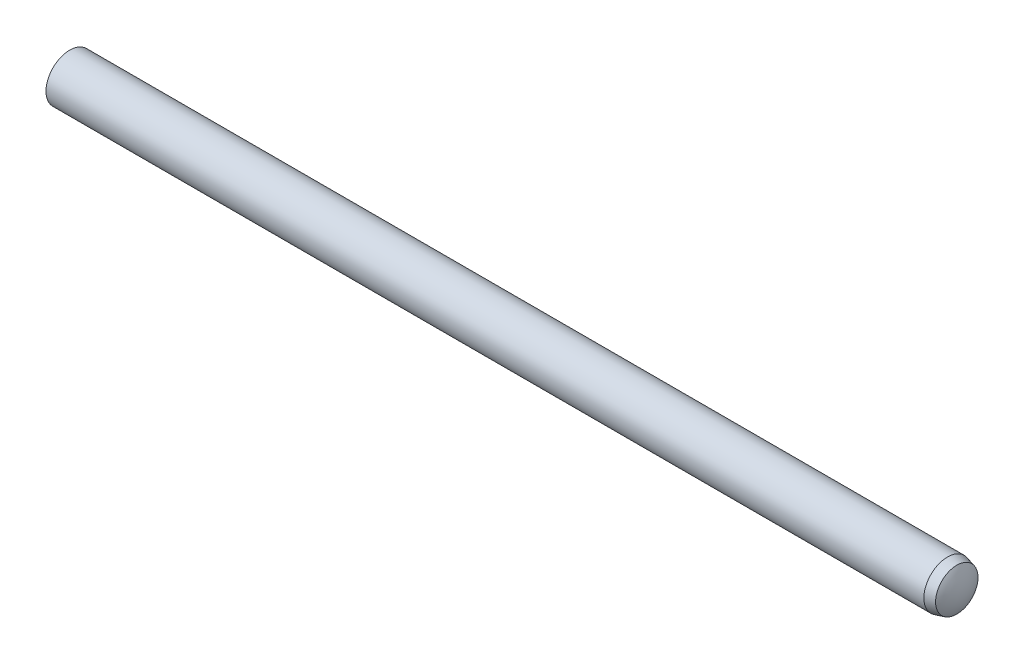
ISO-10303-21;
HEADER;
FILE_DESCRIPTION(('STEP AP214'),'2;1');
FILE_NAME('part.step','',(''),(''),'','','');
FILE_SCHEMA(('AUTOMOTIVE_DESIGN { 1 0 10303 214 1 1 1 1 }'));
ENDSEC;
DATA;
#1=APPLICATION_CONTEXT('core data for automotive mechanical design processes');
#2=APPLICATION_PROTOCOL_DEFINITION('international standard','automotive_design',2000,#1);
#3=PRODUCT_CONTEXT('',#1,'mechanical');
#4=PRODUCT('Part','Part','',(#3));
#5=PRODUCT_RELATED_PRODUCT_CATEGORY('part','',(#4));
#6=PRODUCT_DEFINITION_FORMATION('','',#4);
#7=PRODUCT_DEFINITION_CONTEXT('part definition',#1,'design');
#8=PRODUCT_DEFINITION('design','',#6,#7);
#9=PRODUCT_DEFINITION_SHAPE('','',#8);
#10=(LENGTH_UNIT() NAMED_UNIT(*) SI_UNIT(.MILLI.,.METRE.));
#11=(NAMED_UNIT(*) PLANE_ANGLE_UNIT() SI_UNIT($,.RADIAN.));
#12=(NAMED_UNIT(*) SI_UNIT($,.STERADIAN.) SOLID_ANGLE_UNIT());
#13=UNCERTAINTY_MEASURE_WITH_UNIT(LENGTH_MEASURE(1.E-05),#10,'distance_accuracy_value','');
#14=(GEOMETRIC_REPRESENTATION_CONTEXT(3) GLOBAL_UNCERTAINTY_ASSIGNED_CONTEXT((#13)) GLOBAL_UNIT_ASSIGNED_CONTEXT((#10,
#11,#12)) REPRESENTATION_CONTEXT('',''));
#15=CARTESIAN_POINT('',(0.,0.,0.));
#16=DIRECTION('',(0.,0.,1.));
#17=DIRECTION('',(1.,0.,0.));
#18=AXIS2_PLACEMENT_3D('',#15,#16,#17);
#19=CARTESIAN_POINT('',(-19.,0.,0.));
#20=DIRECTION('',(1.,0.,0.));
#21=DIRECTION('',(0.,0.,-1.));
#22=AXIS2_PLACEMENT_3D('',#19,#20,#21);
#23=CYLINDRICAL_SURFACE('',#22,1.);
#24=CARTESIAN_POINT('',(18.35,0.,0.));
#25=DIRECTION('',(-1.,0.,0.));
#26=DIRECTION('',(0.,0.,1.));
#27=AXIS2_PLACEMENT_3D('',#24,#25,#26);
#28=CIRCLE('',#27,0.999999999999999);
#29=CARTESIAN_POINT('',(18.35,0.,0.999999999999999));
#30=VERTEX_POINT('',#29);
#31=EDGE_CURVE('E13',#30,#30,#28,.T.);
#32=ORIENTED_EDGE('',*,*,#31,.T.);
#33=EDGE_LOOP('',(#32));
#34=FACE_BOUND('',#33,.T.);
#35=CARTESIAN_POINT('',(-18.7,0.,0.));
#36=DIRECTION('',(-1.,0.,0.));
#37=DIRECTION('',(0.,0.,1.));
#38=AXIS2_PLACEMENT_3D('',#35,#36,#37);
#39=CIRCLE('',#38,1.);
#40=CARTESIAN_POINT('',(-18.7,0.,1.));
#41=VERTEX_POINT('',#40);
#42=EDGE_CURVE('E64',#41,#41,#39,.T.);
#43=ORIENTED_EDGE('',*,*,#42,.F.);
#44=EDGE_LOOP('',(#43));
#45=FACE_BOUND('',#44,.T.);
#46=ADVANCED_FACE('F44',(#34,#45),#23,.T.);
#47=CARTESIAN_POINT('',(18.35,0.,0.));
#48=DIRECTION('',(-1.,0.,0.));
#49=DIRECTION('',(0.,0.,1.));
#50=AXIS2_PLACEMENT_3D('',#47,#48,#49);
#51=CONICAL_SURFACE('',#50,0.999999999999999,0.261799387799149);
#52=CARTESIAN_POINT('',(18.74,0.,0.));
#53=DIRECTION('',(-1.,0.,0.));
#54=DIRECTION('',(0.,0.,1.));
#55=AXIS2_PLACEMENT_3D('',#52,#53,#54);
#56=CIRCLE('',#55,0.89549981495186);
#57=CARTESIAN_POINT('',(18.74,0.,0.89549981495186));
#58=VERTEX_POINT('',#57);
#59=EDGE_CURVE('E51',#58,#58,#56,.T.);
#60=ORIENTED_EDGE('',*,*,#59,.T.);
#61=EDGE_LOOP('',(#60));
#62=FACE_BOUND('',#61,.T.);
#63=ORIENTED_EDGE('',*,*,#31,.F.);
#64=EDGE_LOOP('',(#63));
#65=FACE_BOUND('',#64,.T.);
#66=ADVANCED_FACE('F70',(#62,#65),#51,.T.);
#67=CARTESIAN_POINT('',(17.3278463104254,0.,0.));
#68=DIRECTION('',(-1.,0.,0.));
#69=DIRECTION('',(0.,1.,0.));
#70=AXIS2_PLACEMENT_3D('',#67,#68,#69);
#71=SPHERICAL_SURFACE('',#70,1.6721536895746);
#72=CARTESIAN_POINT('',(19.,0.,0.));
#73=VERTEX_POINT('',#72);
#74=VERTEX_LOOP('',#73);
#75=FACE_BOUND('',#74,.T.);
#76=ORIENTED_EDGE('',*,*,#59,.F.);
#77=EDGE_LOOP('',(#76));
#78=FACE_BOUND('',#77,.T.);
#79=ADVANCED_FACE('F60',(#75,#78),#71,.T.);
#80=CARTESIAN_POINT('',(-17.1833333333333,0.,0.));
#81=DIRECTION('',(-1.,0.,0.));
#82=DIRECTION('',(0.,-1.,0.));
#83=AXIS2_PLACEMENT_3D('',#80,#81,#82);
#84=SPHERICAL_SURFACE('',#83,1.81666666666666);
#85=CARTESIAN_POINT('',(-19.,0.,0.));
#86=VERTEX_POINT('',#85);
#87=VERTEX_LOOP('',#86);
#88=FACE_BOUND('',#87,.T.);
#89=ORIENTED_EDGE('',*,*,#42,.T.);
#90=EDGE_LOOP('',(#89));
#91=FACE_BOUND('',#90,.T.);
#92=ADVANCED_FACE('F57',(#88,#91),#84,.T.);
#93=CLOSED_SHELL('',(#46,#66,#79,#92));
#94=MANIFOLD_SOLID_BREP('B2',#93);
#95=ADVANCED_BREP_SHAPE_REPRESENTATION('',(#18,#94),#14);
#96=SHAPE_DEFINITION_REPRESENTATION(#9,#95);
ENDSEC;
END-ISO-10303-21;
